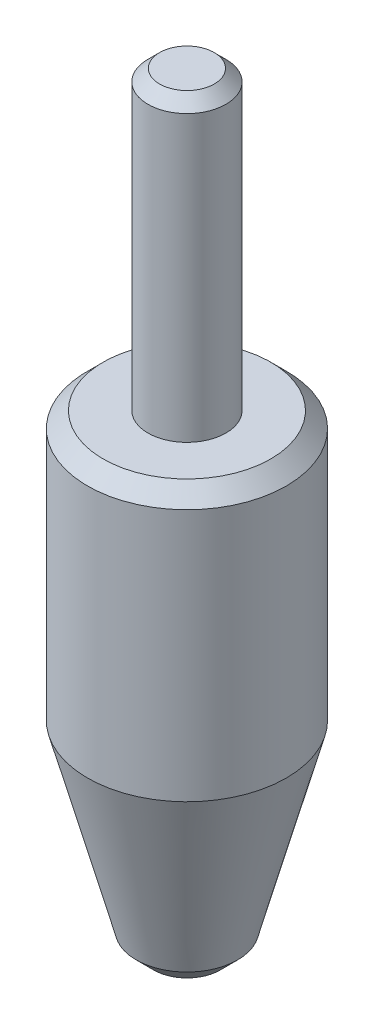
ISO-10303-21;
HEADER;
FILE_DESCRIPTION(('STEP AP214'),'2;1');
FILE_NAME('part.step','',(''),(''),'','','');
FILE_SCHEMA(('AUTOMOTIVE_DESIGN { 1 0 10303 214 1 1 1 1 }'));
ENDSEC;
DATA;
#1=APPLICATION_CONTEXT('core data for automotive mechanical design processes');
#2=APPLICATION_PROTOCOL_DEFINITION('international standard','automotive_design',2000,#1);
#3=PRODUCT_CONTEXT('',#1,'mechanical');
#4=PRODUCT('Part','Part','',(#3));
#5=PRODUCT_RELATED_PRODUCT_CATEGORY('part','',(#4));
#6=PRODUCT_DEFINITION_FORMATION('','',#4);
#7=PRODUCT_DEFINITION_CONTEXT('part definition',#1,'design');
#8=PRODUCT_DEFINITION('design','',#6,#7);
#9=PRODUCT_DEFINITION_SHAPE('','',#8);
#10=(LENGTH_UNIT() NAMED_UNIT(*) SI_UNIT(.MILLI.,.METRE.));
#11=(NAMED_UNIT(*) PLANE_ANGLE_UNIT() SI_UNIT($,.RADIAN.));
#12=(NAMED_UNIT(*) SI_UNIT($,.STERADIAN.) SOLID_ANGLE_UNIT());
#13=UNCERTAINTY_MEASURE_WITH_UNIT(LENGTH_MEASURE(1.E-05),#10,'distance_accuracy_value','');
#14=(GEOMETRIC_REPRESENTATION_CONTEXT(3) GLOBAL_UNCERTAINTY_ASSIGNED_CONTEXT((#13)) GLOBAL_UNIT_ASSIGNED_CONTEXT((#10,
#11,#12)) REPRESENTATION_CONTEXT('',''));
#15=CARTESIAN_POINT('',(0.,0.,0.));
#16=DIRECTION('',(0.,0.,1.));
#17=DIRECTION('',(1.,0.,0.));
#18=AXIS2_PLACEMENT_3D('',#15,#16,#17);
#19=CARTESIAN_POINT('',(0.,10.,0.));
#20=DIRECTION('',(0.,-1.,0.));
#21=DIRECTION('',(1.,0.,0.));
#22=AXIS2_PLACEMENT_3D('',#19,#20,#21);
#23=PLANE('',#22);
#24=CARTESIAN_POINT('',(0.,10.,0.));
#25=DIRECTION('',(0.,-1.,0.));
#26=DIRECTION('',(1.,0.,0.));
#27=AXIS2_PLACEMENT_3D('',#24,#25,#26);
#28=CIRCLE('',#27,0.35);
#29=CARTESIAN_POINT('',(0.35,10.,0.));
#30=VERTEX_POINT('',#29);
#31=EDGE_CURVE('E46',#30,#30,#28,.F.);
#32=ORIENTED_EDGE('',*,*,#31,.T.);
#33=EDGE_LOOP('',(#32));
#34=FACE_BOUND('',#33,.T.);
#35=ADVANCED_FACE('F35',(#34),#23,.F.);
#36=CARTESIAN_POINT('',(0.,-4.07678902814049,0.));
#37=DIRECTION('',(0.,-1.,0.));
#38=DIRECTION('',(1.,0.,0.));
#39=AXIS2_PLACEMENT_3D('',#36,#37,#38);
#40=CYLINDRICAL_SURFACE('',#39,0.5);
#41=CARTESIAN_POINT('',(0.,9.85,0.));
#42=DIRECTION('',(0.,-1.,0.));
#43=DIRECTION('',(1.,0.,0.));
#44=AXIS2_PLACEMENT_3D('',#41,#42,#43);
#45=CIRCLE('',#44,0.5);
#46=CARTESIAN_POINT('',(0.5,9.85,0.));
#47=VERTEX_POINT('',#46);
#48=EDGE_CURVE('E50',#47,#47,#45,.T.);
#49=ORIENTED_EDGE('',*,*,#48,.T.);
#50=EDGE_LOOP('',(#49));
#51=FACE_BOUND('',#50,.T.);
#52=CARTESIAN_POINT('',(0.,6.2,0.));
#53=DIRECTION('',(0.,-1.,0.));
#54=DIRECTION('',(1.,0.,0.));
#55=AXIS2_PLACEMENT_3D('',#52,#53,#54);
#56=CIRCLE('',#55,0.5);
#57=CARTESIAN_POINT('',(0.5,6.2,0.));
#58=VERTEX_POINT('',#57);
#59=EDGE_CURVE('E55',#58,#58,#56,.T.);
#60=ORIENTED_EDGE('',*,*,#59,.F.);
#61=EDGE_LOOP('',(#60));
#62=FACE_BOUND('',#61,.T.);
#63=ADVANCED_FACE('F98',(#51,#62),#40,.T.);
#64=CARTESIAN_POINT('',(-0.5,6.2,0.));
#65=DIRECTION('',(0.,-1.,0.));
#66=DIRECTION('',(1.,0.,0.));
#67=AXIS2_PLACEMENT_3D('',#64,#65,#66);
#68=PLANE('',#67);
#69=CARTESIAN_POINT('',(0.,6.2,0.));
#70=DIRECTION('',(0.,-1.,0.));
#71=DIRECTION('',(1.,0.,0.));
#72=AXIS2_PLACEMENT_3D('',#69,#70,#71);
#73=CIRCLE('',#72,1.075);
#74=CARTESIAN_POINT('',(1.075,6.2,0.));
#75=VERTEX_POINT('',#74);
#76=EDGE_CURVE('E10',#75,#75,#73,.F.);
#77=ORIENTED_EDGE('',*,*,#76,.T.);
#78=EDGE_LOOP('',(#77));
#79=FACE_BOUND('',#78,.T.);
#80=ORIENTED_EDGE('',*,*,#59,.T.);
#81=EDGE_LOOP('',(#80));
#82=FACE_BOUND('',#81,.T.);
#83=ADVANCED_FACE('F93',(#79,#82),#68,.F.);
#84=CARTESIAN_POINT('',(0.,-4.07678902814049,0.));
#85=DIRECTION('',(0.,-1.,0.));
#86=DIRECTION('',(1.,0.,0.));
#87=AXIS2_PLACEMENT_3D('',#84,#85,#86);
#88=CYLINDRICAL_SURFACE('',#87,1.275);
#89=CARTESIAN_POINT('',(0.,6.,0.));
#90=DIRECTION('',(0.,-1.,0.));
#91=DIRECTION('',(1.,0.,0.));
#92=AXIS2_PLACEMENT_3D('',#89,#90,#91);
#93=CIRCLE('',#92,1.275);
#94=CARTESIAN_POINT('',(1.275,6.,0.));
#95=VERTEX_POINT('',#94);
#96=EDGE_CURVE('E42',#95,#95,#93,.T.);
#97=ORIENTED_EDGE('',*,*,#96,.T.);
#98=EDGE_LOOP('',(#97));
#99=FACE_BOUND('',#98,.T.);
#100=CARTESIAN_POINT('',(0.,2.75753175473054,0.));
#101=DIRECTION('',(0.,-1.,0.));
#102=DIRECTION('',(1.,0.,0.));
#103=AXIS2_PLACEMENT_3D('',#100,#101,#102);
#104=CIRCLE('',#103,1.275);
#105=CARTESIAN_POINT('',(1.275,2.75753175473054,0.));
#106=VERTEX_POINT('',#105);
#107=EDGE_CURVE('E58',#106,#106,#104,.T.);
#108=ORIENTED_EDGE('',*,*,#107,.F.);
#109=EDGE_LOOP('',(#108));
#110=FACE_BOUND('',#109,.T.);
#111=ADVANCED_FACE('F88',(#99,#110),#88,.T.);
#112=CARTESIAN_POINT('',(0.,2.75753175473054,0.));
#113=DIRECTION('',(0.,1.,0.));
#114=DIRECTION('',(-1.,0.,0.));
#115=AXIS2_PLACEMENT_3D('',#112,#113,#114);
#116=CONICAL_SURFACE('',#115,1.275,0.26179938779915);
#117=CARTESIAN_POINT('',(0.,0.424999999999999,0.));
#118=DIRECTION('',(0.,-1.,0.));
#119=DIRECTION('',(1.,0.,0.));
#120=AXIS2_PLACEMENT_3D('',#117,#118,#119);
#121=CIRCLE('',#120,0.65);
#122=CARTESIAN_POINT('',(0.65,0.424999999999999,0.));
#123=VERTEX_POINT('',#122);
#124=EDGE_CURVE('E61',#123,#123,#121,.T.);
#125=ORIENTED_EDGE('',*,*,#124,.F.);
#126=EDGE_LOOP('',(#125));
#127=FACE_BOUND('',#126,.T.);
#128=ORIENTED_EDGE('',*,*,#107,.T.);
#129=EDGE_LOOP('',(#128));
#130=FACE_BOUND('',#129,.T.);
#131=ADVANCED_FACE('F82',(#127,#130),#116,.T.);
#132=CARTESIAN_POINT('',(0.,0.424999999999999,0.));
#133=DIRECTION('',(0.,1.,0.));
#134=DIRECTION('',(-1.,0.,0.));
#135=AXIS2_PLACEMENT_3D('',#132,#133,#134);
#136=CONICAL_SURFACE('',#135,0.65,0.785398163397449);
#137=CARTESIAN_POINT('',(0.,0.2,0.));
#138=DIRECTION('',(0.,-1.,0.));
#139=DIRECTION('',(1.,0.,0.));
#140=AXIS2_PLACEMENT_3D('',#137,#138,#139);
#141=CIRCLE('',#140,0.425);
#142=CARTESIAN_POINT('',(0.425,0.2,0.));
#143=VERTEX_POINT('',#142);
#144=EDGE_CURVE('E64',#143,#143,#141,.T.);
#145=ORIENTED_EDGE('',*,*,#144,.F.);
#146=EDGE_LOOP('',(#145));
#147=FACE_BOUND('',#146,.T.);
#148=ORIENTED_EDGE('',*,*,#124,.T.);
#149=EDGE_LOOP('',(#148));
#150=FACE_BOUND('',#149,.T.);
#151=ADVANCED_FACE('F76',(#147,#150),#136,.T.);
#152=CARTESIAN_POINT('',(-0.425,0.2,0.));
#153=DIRECTION('',(0.,1.,0.));
#154=DIRECTION('',(-1.,0.,0.));
#155=AXIS2_PLACEMENT_3D('',#152,#153,#154);
#156=PLANE('',#155);
#157=CARTESIAN_POINT('',(0.,0.2,0.));
#158=DIRECTION('',(0.,-1.,0.));
#159=DIRECTION('',(1.,0.,0.));
#160=AXIS2_PLACEMENT_3D('',#157,#158,#159);
#161=CIRCLE('',#160,0.346410161513774);
#162=CARTESIAN_POINT('',(0.346410161513774,0.2,0.));
#163=VERTEX_POINT('',#162);
#164=EDGE_CURVE('E67',#163,#163,#161,.T.);
#165=ORIENTED_EDGE('',*,*,#164,.F.);
#166=EDGE_LOOP('',(#165));
#167=FACE_BOUND('',#166,.T.);
#168=ORIENTED_EDGE('',*,*,#144,.T.);
#169=EDGE_LOOP('',(#168));
#170=FACE_BOUND('',#169,.T.);
#171=ADVANCED_FACE('F73',(#167,#170),#156,.F.);
#172=CARTESIAN_POINT('',(0.,0.4,0.));
#173=DIRECTION('',(0.,-1.,0.));
#174=DIRECTION('',(-1.,0.,0.));
#175=AXIS2_PLACEMENT_3D('',#172,#173,#174);
#176=SPHERICAL_SURFACE('',#175,0.4);
#177=ORIENTED_EDGE('',*,*,#164,.T.);
#178=EDGE_LOOP('',(#177));
#179=FACE_BOUND('',#178,.T.);
#180=ADVANCED_FACE('F71',(#179),#176,.T.);
#181=CARTESIAN_POINT('',(0.,9.85,0.));
#182=DIRECTION('',(0.,-1.,0.));
#183=DIRECTION('',(1.,0.,0.));
#184=AXIS2_PLACEMENT_3D('',#181,#182,#183);
#185=CONICAL_SURFACE('',#184,0.5,0.785398163397445);
#186=ORIENTED_EDGE('',*,*,#31,.F.);
#187=EDGE_LOOP('',(#186));
#188=FACE_BOUND('',#187,.T.);
#189=ORIENTED_EDGE('',*,*,#48,.F.);
#190=EDGE_LOOP('',(#189));
#191=FACE_BOUND('',#190,.T.);
#192=ADVANCED_FACE('F108',(#188,#191),#185,.T.);
#193=CARTESIAN_POINT('',(0.,6.,0.));
#194=DIRECTION('',(0.,-1.,0.));
#195=DIRECTION('',(1.,0.,0.));
#196=AXIS2_PLACEMENT_3D('',#193,#194,#195);
#197=CONICAL_SURFACE('',#196,1.275,0.78539816339745);
#198=ORIENTED_EDGE('',*,*,#76,.F.);
#199=EDGE_LOOP('',(#198));
#200=FACE_BOUND('',#199,.T.);
#201=ORIENTED_EDGE('',*,*,#96,.F.);
#202=EDGE_LOOP('',(#201));
#203=FACE_BOUND('',#202,.T.);
#204=ADVANCED_FACE('F37',(#200,#203),#197,.T.);
#205=CLOSED_SHELL('',(#35,#63,#83,#111,#131,#151,#171,#180,#192,#204));
#206=MANIFOLD_SOLID_BREP('B2',#205);
#207=ADVANCED_BREP_SHAPE_REPRESENTATION('',(#18,#206),#14);
#208=SHAPE_DEFINITION_REPRESENTATION(#9,#207);
ENDSEC;
END-ISO-10303-21;
